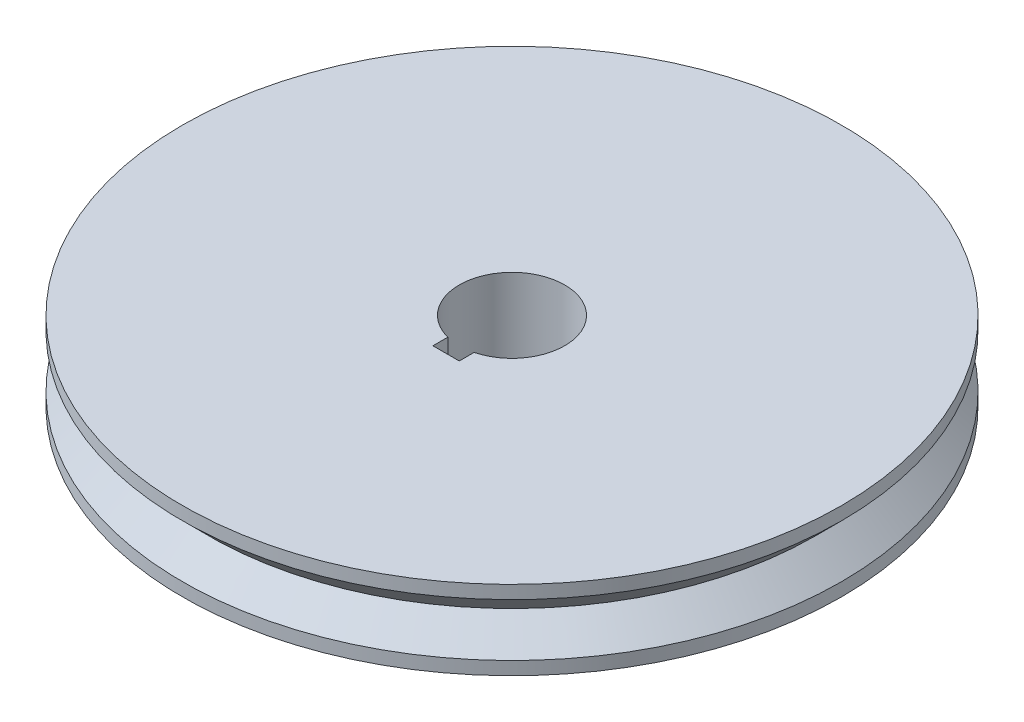
ISO-10303-21;
HEADER;
FILE_DESCRIPTION(('STEP AP214'),'2;1');
FILE_NAME('part.step','',(''),(''),'','','');
FILE_SCHEMA(('AUTOMOTIVE_DESIGN { 1 0 10303 214 1 1 1 1 }'));
ENDSEC;
DATA;
#1=APPLICATION_CONTEXT('core data for automotive mechanical design processes');
#2=APPLICATION_PROTOCOL_DEFINITION('international standard','automotive_design',2000,#1);
#3=PRODUCT_CONTEXT('',#1,'mechanical');
#4=PRODUCT('Part','Part','',(#3));
#5=PRODUCT_RELATED_PRODUCT_CATEGORY('part','',(#4));
#6=PRODUCT_DEFINITION_FORMATION('','',#4);
#7=PRODUCT_DEFINITION_CONTEXT('part definition',#1,'design');
#8=PRODUCT_DEFINITION('design','',#6,#7);
#9=PRODUCT_DEFINITION_SHAPE('','',#8);
#10=(LENGTH_UNIT() NAMED_UNIT(*) SI_UNIT(.MILLI.,.METRE.));
#11=(NAMED_UNIT(*) PLANE_ANGLE_UNIT() SI_UNIT($,.RADIAN.));
#12=(NAMED_UNIT(*) SI_UNIT($,.STERADIAN.) SOLID_ANGLE_UNIT());
#13=UNCERTAINTY_MEASURE_WITH_UNIT(LENGTH_MEASURE(1.E-05),#10,'distance_accuracy_value','');
#14=(GEOMETRIC_REPRESENTATION_CONTEXT(3) GLOBAL_UNCERTAINTY_ASSIGNED_CONTEXT((#13)) GLOBAL_UNIT_ASSIGNED_CONTEXT((#10,
#11,#12)) REPRESENTATION_CONTEXT('',''));
#15=CARTESIAN_POINT('',(0.,0.,0.));
#16=DIRECTION('',(0.,0.,1.));
#17=DIRECTION('',(1.,0.,0.));
#18=AXIS2_PLACEMENT_3D('',#15,#16,#17);
#19=CARTESIAN_POINT('',(0.,-15.,0.));
#20=DIRECTION('',(0.,1.,0.));
#21=DIRECTION('',(-1.,0.,0.));
#22=AXIS2_PLACEMENT_3D('',#19,#20,#21);
#23=PLANE('',#22);
#24=CARTESIAN_POINT('',(0.,-15.,0.));
#25=DIRECTION('',(0.,1.,0.));
#26=DIRECTION('',(-1.,0.,0.));
#27=AXIS2_PLACEMENT_3D('',#24,#25,#26);
#28=CIRCLE('',#27,20.);
#29=CARTESIAN_POINT('',(5.,-15.,19.3649167310371));
#30=VERTEX_POINT('',#29);
#31=CARTESIAN_POINT('',(-5.,-15.,19.3649167310371));
#32=VERTEX_POINT('',#31);
#33=EDGE_CURVE('E80',#30,#32,#28,.T.);
#34=ORIENTED_EDGE('',*,*,#33,.T.);
#35=DIRECTION('',(0.,0.,1.));
#36=VECTOR('',#35,1.);
#37=CARTESIAN_POINT('',(-5.,-15.,19.3649167310371));
#38=LINE('',#37,#36);
#39=CARTESIAN_POINT('',(-5.,-15.,25.));
#40=VERTEX_POINT('',#39);
#41=EDGE_CURVE('E74',#32,#40,#38,.T.);
#42=ORIENTED_EDGE('',*,*,#41,.T.);
#43=DIRECTION('',(1.,0.,0.));
#44=VECTOR('',#43,1.);
#45=CARTESIAN_POINT('',(5.,-15.,25.));
#46=LINE('',#45,#44);
#47=CARTESIAN_POINT('',(5.,-15.,25.));
#48=VERTEX_POINT('',#47);
#49=EDGE_CURVE('E83',#40,#48,#46,.T.);
#50=ORIENTED_EDGE('',*,*,#49,.T.);
#51=DIRECTION('',(0.,0.,-1.));
#52=VECTOR('',#51,1.);
#53=CARTESIAN_POINT('',(5.,-15.,19.3649167310371));
#54=LINE('',#53,#52);
#55=EDGE_CURVE('E46',#48,#30,#54,.T.);
#56=ORIENTED_EDGE('',*,*,#55,.T.);
#57=EDGE_LOOP('',(#34,#42,#50,#56));
#58=FACE_BOUND('',#57,.T.);
#59=CARTESIAN_POINT('',(0.,-15.,0.));
#60=DIRECTION('',(0.,1.,0.));
#61=DIRECTION('',(-1.,0.,0.));
#62=AXIS2_PLACEMENT_3D('',#59,#60,#61);
#63=CIRCLE('',#62,125.);
#64=CARTESIAN_POINT('',(-125.,-15.,0.));
#65=VERTEX_POINT('',#64);
#66=EDGE_CURVE('E11',#65,#65,#63,.T.);
#67=ORIENTED_EDGE('',*,*,#66,.F.);
#68=EDGE_LOOP('',(#67));
#69=FACE_BOUND('',#68,.T.);
#70=ADVANCED_FACE('F32',(#58,#69),#23,.F.);
#71=CARTESIAN_POINT('',(0.,-15.,0.));
#72=DIRECTION('',(0.,1.,0.));
#73=DIRECTION('',(-1.,0.,0.));
#74=AXIS2_PLACEMENT_3D('',#71,#72,#73);
#75=CYLINDRICAL_SURFACE('',#74,125.);
#76=CARTESIAN_POINT('',(0.,-10.,0.));
#77=DIRECTION('',(0.,1.,0.));
#78=DIRECTION('',(-1.,0.,0.));
#79=AXIS2_PLACEMENT_3D('',#76,#77,#78);
#80=CIRCLE('',#79,125.);
#81=CARTESIAN_POINT('',(-125.,-10.,0.));
#82=VERTEX_POINT('',#81);
#83=EDGE_CURVE('E39',#82,#82,#80,.T.);
#84=ORIENTED_EDGE('',*,*,#83,.F.);
#85=EDGE_LOOP('',(#84));
#86=FACE_BOUND('',#85,.T.);
#87=ORIENTED_EDGE('',*,*,#66,.T.);
#88=EDGE_LOOP('',(#87));
#89=FACE_BOUND('',#88,.T.);
#90=ADVANCED_FACE('F120',(#86,#89),#75,.T.);
#91=CARTESIAN_POINT('',(0.,-10.,0.));
#92=DIRECTION('',(0.,-1.,0.));
#93=DIRECTION('',(1.,0.,0.));
#94=AXIS2_PLACEMENT_3D('',#91,#92,#93);
#95=CONICAL_SURFACE('',#94,125.,0.785398163397449);
#96=CARTESIAN_POINT('',(0.,0.,0.));
#97=DIRECTION('',(0.,1.,0.));
#98=DIRECTION('',(-1.,0.,0.));
#99=AXIS2_PLACEMENT_3D('',#96,#97,#98);
#100=CIRCLE('',#99,115.);
#101=CARTESIAN_POINT('',(-115.,0.,0.));
#102=VERTEX_POINT('',#101);
#103=EDGE_CURVE('E113',#102,#102,#100,.T.);
#104=ORIENTED_EDGE('',*,*,#103,.F.);
#105=EDGE_LOOP('',(#104));
#106=FACE_BOUND('',#105,.T.);
#107=ORIENTED_EDGE('',*,*,#83,.T.);
#108=EDGE_LOOP('',(#107));
#109=FACE_BOUND('',#108,.T.);
#110=ADVANCED_FACE('F118',(#106,#109),#95,.T.);
#111=CARTESIAN_POINT('',(0.,0.,0.));
#112=DIRECTION('',(0.,1.,0.));
#113=DIRECTION('',(-1.,0.,0.));
#114=AXIS2_PLACEMENT_3D('',#111,#112,#113);
#115=CONICAL_SURFACE('',#114,115.,0.785398163397449);
#116=CARTESIAN_POINT('',(0.,10.,0.));
#117=DIRECTION('',(0.,1.,0.));
#118=DIRECTION('',(-1.,0.,0.));
#119=AXIS2_PLACEMENT_3D('',#116,#117,#118);
#120=CIRCLE('',#119,125.);
#121=CARTESIAN_POINT('',(-125.,10.,0.));
#122=VERTEX_POINT('',#121);
#123=EDGE_CURVE('E110',#122,#122,#120,.T.);
#124=ORIENTED_EDGE('',*,*,#123,.F.);
#125=EDGE_LOOP('',(#124));
#126=FACE_BOUND('',#125,.T.);
#127=ORIENTED_EDGE('',*,*,#103,.T.);
#128=EDGE_LOOP('',(#127));
#129=FACE_BOUND('',#128,.T.);
#130=ADVANCED_FACE('F139',(#126,#129),#115,.T.);
#131=CARTESIAN_POINT('',(0.,-15.,0.));
#132=DIRECTION('',(0.,1.,0.));
#133=DIRECTION('',(-1.,0.,0.));
#134=AXIS2_PLACEMENT_3D('',#131,#132,#133);
#135=CYLINDRICAL_SURFACE('',#134,125.);
#136=CARTESIAN_POINT('',(0.,15.,0.));
#137=DIRECTION('',(0.,1.,0.));
#138=DIRECTION('',(-1.,0.,0.));
#139=AXIS2_PLACEMENT_3D('',#136,#137,#138);
#140=CIRCLE('',#139,125.);
#141=CARTESIAN_POINT('',(-125.,15.,0.));
#142=VERTEX_POINT('',#141);
#143=EDGE_CURVE('E104',#142,#142,#140,.T.);
#144=ORIENTED_EDGE('',*,*,#143,.F.);
#145=EDGE_LOOP('',(#144));
#146=FACE_BOUND('',#145,.T.);
#147=ORIENTED_EDGE('',*,*,#123,.T.);
#148=EDGE_LOOP('',(#147));
#149=FACE_BOUND('',#148,.T.);
#150=ADVANCED_FACE('F147',(#146,#149),#135,.T.);
#151=CARTESIAN_POINT('',(0.,15.,0.));
#152=DIRECTION('',(0.,-1.,0.));
#153=DIRECTION('',(1.,0.,0.));
#154=AXIS2_PLACEMENT_3D('',#151,#152,#153);
#155=PLANE('',#154);
#156=DIRECTION('',(1.,0.,0.));
#157=VECTOR('',#156,1.);
#158=CARTESIAN_POINT('',(5.,15.,25.));
#159=LINE('',#158,#157);
#160=CARTESIAN_POINT('',(-5.,15.,25.));
#161=VERTEX_POINT('',#160);
#162=CARTESIAN_POINT('',(5.,15.,25.));
#163=VERTEX_POINT('',#162);
#164=EDGE_CURVE('E98',#161,#163,#159,.T.);
#165=ORIENTED_EDGE('',*,*,#164,.F.);
#166=DIRECTION('',(0.,0.,1.));
#167=VECTOR('',#166,1.);
#168=CARTESIAN_POINT('',(-5.,15.,19.3649167310371));
#169=LINE('',#168,#167);
#170=CARTESIAN_POINT('',(-5.,15.,19.3649167310371));
#171=VERTEX_POINT('',#170);
#172=EDGE_CURVE('E54',#171,#161,#169,.T.);
#173=ORIENTED_EDGE('',*,*,#172,.F.);
#174=CARTESIAN_POINT('',(0.,15.,0.));
#175=DIRECTION('',(0.,1.,0.));
#176=DIRECTION('',(-1.,0.,0.));
#177=AXIS2_PLACEMENT_3D('',#174,#175,#176);
#178=CIRCLE('',#177,20.);
#179=CARTESIAN_POINT('',(5.,15.,19.3649167310371));
#180=VERTEX_POINT('',#179);
#181=EDGE_CURVE('E89',#180,#171,#178,.T.);
#182=ORIENTED_EDGE('',*,*,#181,.F.);
#183=DIRECTION('',(0.,0.,-1.));
#184=VECTOR('',#183,1.);
#185=CARTESIAN_POINT('',(5.,15.,19.3649167310371));
#186=LINE('',#185,#184);
#187=EDGE_CURVE('E92',#163,#180,#186,.T.);
#188=ORIENTED_EDGE('',*,*,#187,.F.);
#189=EDGE_LOOP('',(#165,#173,#182,#188));
#190=FACE_BOUND('',#189,.T.);
#191=ORIENTED_EDGE('',*,*,#143,.T.);
#192=EDGE_LOOP('',(#191));
#193=FACE_BOUND('',#192,.T.);
#194=ADVANCED_FACE('F154',(#190,#193),#155,.F.);
#195=CARTESIAN_POINT('',(-5.,-15.,19.3649167310371));
#196=DIRECTION('',(-1.,0.,0.));
#197=DIRECTION('',(0.,0.,1.));
#198=AXIS2_PLACEMENT_3D('',#195,#196,#197);
#199=PLANE('',#198);
#200=ORIENTED_EDGE('',*,*,#172,.T.);
#201=DIRECTION('',(0.,1.,0.));
#202=VECTOR('',#201,1.);
#203=CARTESIAN_POINT('',(-5.,-15.,25.));
#204=LINE('',#203,#202);
#205=EDGE_CURVE('E70',#40,#161,#204,.T.);
#206=ORIENTED_EDGE('',*,*,#205,.F.);
#207=ORIENTED_EDGE('',*,*,#41,.F.);
#208=DIRECTION('',(0.,1.,0.));
#209=VECTOR('',#208,1.);
#210=CARTESIAN_POINT('',(-5.,-15.,19.3649167310371));
#211=LINE('',#210,#209);
#212=EDGE_CURVE('E102',#32,#171,#211,.T.);
#213=ORIENTED_EDGE('',*,*,#212,.T.);
#214=EDGE_LOOP('',(#200,#206,#207,#213));
#215=FACE_BOUND('',#214,.T.);
#216=ADVANCED_FACE('F72',(#215),#199,.F.);
#217=CARTESIAN_POINT('',(0.,-15.,0.));
#218=DIRECTION('',(0.,1.,0.));
#219=DIRECTION('',(-1.,0.,0.));
#220=AXIS2_PLACEMENT_3D('',#217,#218,#219);
#221=CYLINDRICAL_SURFACE('',#220,20.);
#222=ORIENTED_EDGE('',*,*,#181,.T.);
#223=ORIENTED_EDGE('',*,*,#212,.F.);
#224=ORIENTED_EDGE('',*,*,#33,.F.);
#225=DIRECTION('',(0.,1.,0.));
#226=VECTOR('',#225,1.);
#227=CARTESIAN_POINT('',(5.,-15.,19.3649167310371));
#228=LINE('',#227,#226);
#229=EDGE_CURVE('E105',#30,#180,#228,.T.);
#230=ORIENTED_EDGE('',*,*,#229,.T.);
#231=EDGE_LOOP('',(#222,#223,#224,#230));
#232=FACE_BOUND('',#231,.T.);
#233=ADVANCED_FACE('F168',(#232),#221,.F.);
#234=CARTESIAN_POINT('',(5.,-15.,19.3649167310371));
#235=DIRECTION('',(1.,0.,0.));
#236=DIRECTION('',(0.,0.,-1.));
#237=AXIS2_PLACEMENT_3D('',#234,#235,#236);
#238=PLANE('',#237);
#239=ORIENTED_EDGE('',*,*,#187,.T.);
#240=ORIENTED_EDGE('',*,*,#229,.F.);
#241=ORIENTED_EDGE('',*,*,#55,.F.);
#242=DIRECTION('',(0.,1.,0.));
#243=VECTOR('',#242,1.);
#244=CARTESIAN_POINT('',(5.,-15.,25.));
#245=LINE('',#244,#243);
#246=EDGE_CURVE('E79',#48,#163,#245,.T.);
#247=ORIENTED_EDGE('',*,*,#246,.T.);
#248=EDGE_LOOP('',(#239,#240,#241,#247));
#249=FACE_BOUND('',#248,.T.);
#250=ADVANCED_FACE('F175',(#249),#238,.F.);
#251=CARTESIAN_POINT('',(5.,-15.,25.));
#252=DIRECTION('',(0.,0.,1.));
#253=DIRECTION('',(1.,0.,0.));
#254=AXIS2_PLACEMENT_3D('',#251,#252,#253);
#255=PLANE('',#254);
#256=ORIENTED_EDGE('',*,*,#164,.T.);
#257=ORIENTED_EDGE('',*,*,#246,.F.);
#258=ORIENTED_EDGE('',*,*,#49,.F.);
#259=ORIENTED_EDGE('',*,*,#205,.T.);
#260=EDGE_LOOP('',(#256,#257,#258,#259));
#261=FACE_BOUND('',#260,.T.);
#262=ADVANCED_FACE('F84',(#261),#255,.F.);
#263=CLOSED_SHELL('',(#70,#90,#110,#130,#150,#194,#216,#233,#250,#262));
#264=MANIFOLD_SOLID_BREP('B2',#263);
#265=ADVANCED_BREP_SHAPE_REPRESENTATION('',(#18,#264),#14);
#266=SHAPE_DEFINITION_REPRESENTATION(#9,#265);
ENDSEC;
END-ISO-10303-21;
